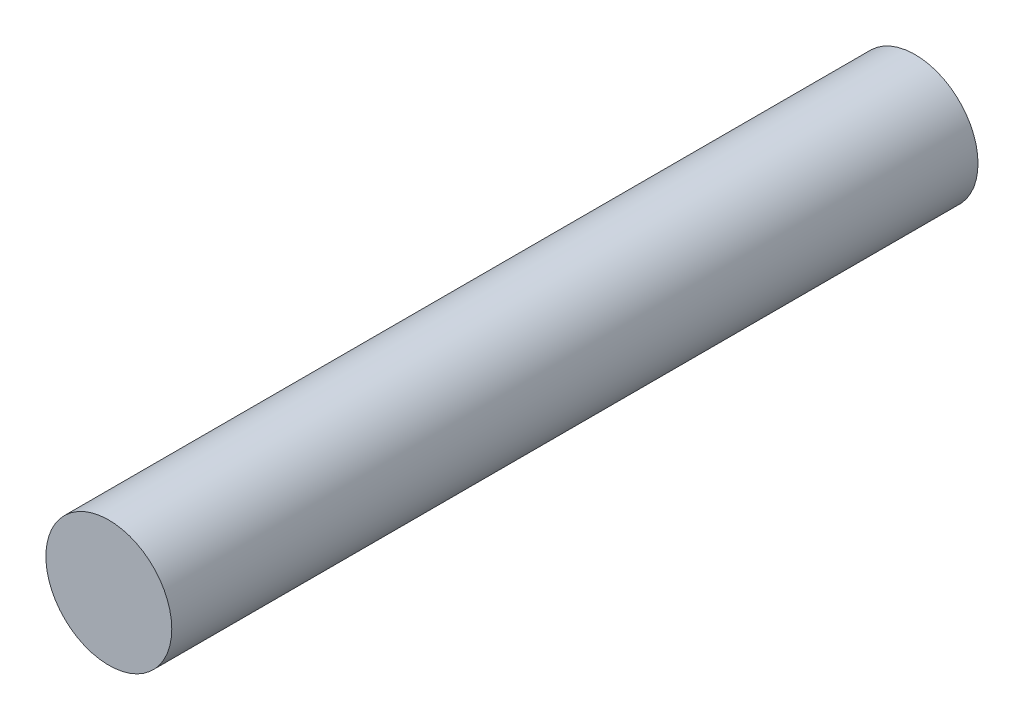
ISO-10303-21;
HEADER;
FILE_DESCRIPTION(('STEP AP214'),'2;1');
FILE_NAME('part.step','',(''),(''),'','','');
FILE_SCHEMA(('AUTOMOTIVE_DESIGN { 1 0 10303 214 1 1 1 1 }'));
ENDSEC;
DATA;
#1=APPLICATION_CONTEXT('core data for automotive mechanical design processes');
#2=APPLICATION_PROTOCOL_DEFINITION('international standard','automotive_design',2000,#1);
#3=PRODUCT_CONTEXT('',#1,'mechanical');
#4=PRODUCT('Part','Part','',(#3));
#5=PRODUCT_RELATED_PRODUCT_CATEGORY('part','',(#4));
#6=PRODUCT_DEFINITION_FORMATION('','',#4);
#7=PRODUCT_DEFINITION_CONTEXT('part definition',#1,'design');
#8=PRODUCT_DEFINITION('design','',#6,#7);
#9=PRODUCT_DEFINITION_SHAPE('','',#8);
#10=(LENGTH_UNIT() NAMED_UNIT(*) SI_UNIT(.MILLI.,.METRE.));
#11=(NAMED_UNIT(*) PLANE_ANGLE_UNIT() SI_UNIT($,.RADIAN.));
#12=(NAMED_UNIT(*) SI_UNIT($,.STERADIAN.) SOLID_ANGLE_UNIT());
#13=UNCERTAINTY_MEASURE_WITH_UNIT(LENGTH_MEASURE(1.E-05),#10,'distance_accuracy_value','');
#14=(GEOMETRIC_REPRESENTATION_CONTEXT(3) GLOBAL_UNCERTAINTY_ASSIGNED_CONTEXT((#13)) GLOBAL_UNIT_ASSIGNED_CONTEXT((#10,
#11,#12)) REPRESENTATION_CONTEXT('',''));
#15=CARTESIAN_POINT('',(0.,0.,0.));
#16=DIRECTION('',(0.,0.,1.));
#17=DIRECTION('',(1.,0.,0.));
#18=AXIS2_PLACEMENT_3D('',#15,#16,#17);
#19=CARTESIAN_POINT('',(0.,0.,14.478));
#20=DIRECTION('',(0.,0.,-1.));
#21=DIRECTION('',(-1.,0.,0.));
#22=AXIS2_PLACEMENT_3D('',#19,#20,#21);
#23=CYLINDRICAL_SURFACE('',#22,1.1303);
#24=CARTESIAN_POINT('',(0.,0.,14.478));
#25=DIRECTION('',(0.,0.,1.));
#26=DIRECTION('',(1.,0.,0.));
#27=AXIS2_PLACEMENT_3D('',#24,#25,#26);
#28=CIRCLE('',#27,1.1303);
#29=CARTESIAN_POINT('',(1.1303,0.,14.478));
#30=VERTEX_POINT('',#29);
#31=EDGE_CURVE('E10',#30,#30,#28,.T.);
#32=ORIENTED_EDGE('',*,*,#31,.F.);
#33=EDGE_LOOP('',(#32));
#34=FACE_BOUND('',#33,.T.);
#35=CARTESIAN_POINT('',(0.,0.,0.));
#36=DIRECTION('',(0.,0.,1.));
#37=DIRECTION('',(1.,0.,0.));
#38=AXIS2_PLACEMENT_3D('',#35,#36,#37);
#39=CIRCLE('',#38,1.1303);
#40=CARTESIAN_POINT('',(1.1303,0.,0.));
#41=VERTEX_POINT('',#40);
#42=EDGE_CURVE('E46',#41,#41,#39,.T.);
#43=ORIENTED_EDGE('',*,*,#42,.T.);
#44=EDGE_LOOP('',(#43));
#45=FACE_BOUND('',#44,.T.);
#46=ADVANCED_FACE('F43',(#34,#45),#23,.T.);
#47=CARTESIAN_POINT('',(0.,0.,14.478));
#48=DIRECTION('',(0.,0.,1.));
#49=DIRECTION('',(1.,0.,0.));
#50=AXIS2_PLACEMENT_3D('',#47,#48,#49);
#51=PLANE('',#50);
#52=ORIENTED_EDGE('',*,*,#31,.T.);
#53=EDGE_LOOP('',(#52));
#54=FACE_BOUND('',#53,.T.);
#55=ADVANCED_FACE('F60',(#54),#51,.T.);
#56=CARTESIAN_POINT('',(0.,0.,0.));
#57=DIRECTION('',(0.,0.,1.));
#58=DIRECTION('',(1.,0.,0.));
#59=AXIS2_PLACEMENT_3D('',#56,#57,#58);
#60=PLANE('',#59);
#61=ORIENTED_EDGE('',*,*,#42,.F.);
#62=EDGE_LOOP('',(#61));
#63=FACE_BOUND('',#62,.T.);
#64=ADVANCED_FACE('F58',(#63),#60,.F.);
#65=CLOSED_SHELL('',(#46,#55,#64));
#66=MANIFOLD_SOLID_BREP('B2',#65);
#67=ADVANCED_BREP_SHAPE_REPRESENTATION('',(#18,#66),#14);
#68=SHAPE_DEFINITION_REPRESENTATION(#9,#67);
ENDSEC;
END-ISO-10303-21;
